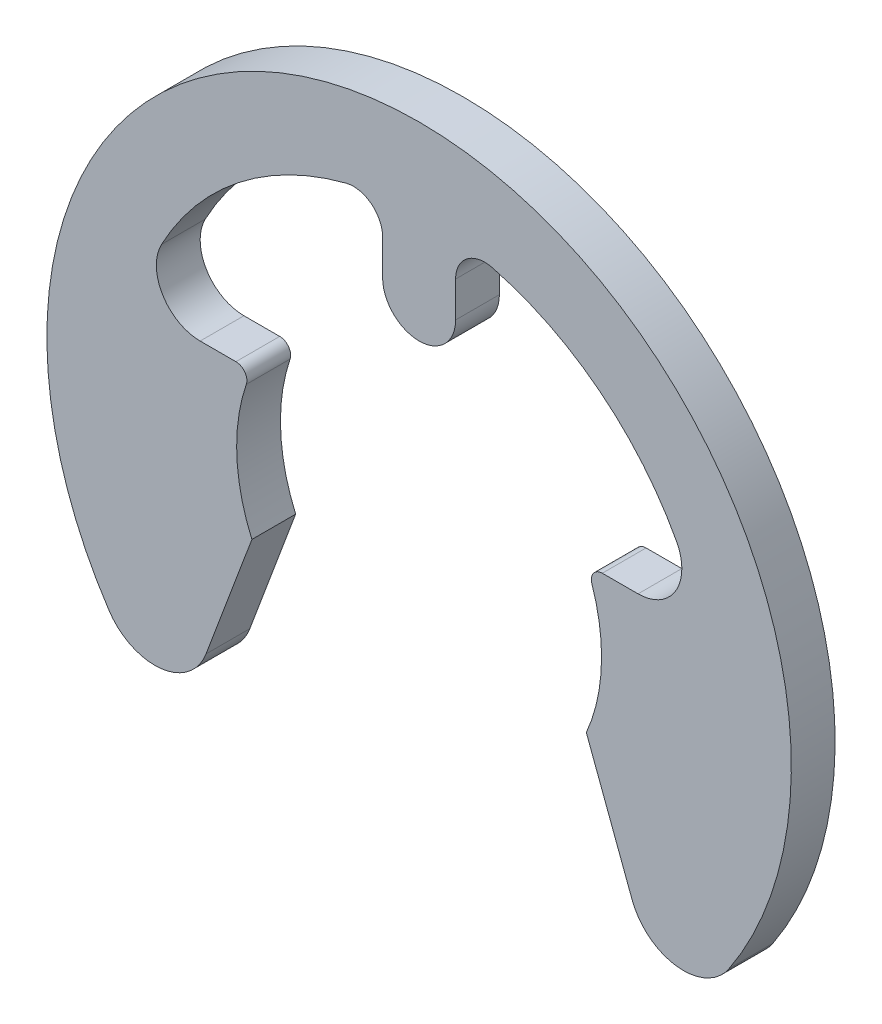
ISO-10303-21;
HEADER;
FILE_DESCRIPTION(('STEP AP214'),'2;1');
FILE_NAME('part.step','',(''),(''),'','','');
FILE_SCHEMA(('AUTOMOTIVE_DESIGN { 1 0 10303 214 1 1 1 1 }'));
ENDSEC;
DATA;
#1=APPLICATION_CONTEXT('core data for automotive mechanical design processes');
#2=APPLICATION_PROTOCOL_DEFINITION('international standard','automotive_design',2000,#1);
#3=PRODUCT_CONTEXT('',#1,'mechanical');
#4=PRODUCT('Part','Part','',(#3));
#5=PRODUCT_RELATED_PRODUCT_CATEGORY('part','',(#4));
#6=PRODUCT_DEFINITION_FORMATION('','',#4);
#7=PRODUCT_DEFINITION_CONTEXT('part definition',#1,'design');
#8=PRODUCT_DEFINITION('design','',#6,#7);
#9=PRODUCT_DEFINITION_SHAPE('','',#8);
#10=(LENGTH_UNIT() NAMED_UNIT(*) SI_UNIT(.MILLI.,.METRE.));
#11=(NAMED_UNIT(*) PLANE_ANGLE_UNIT() SI_UNIT($,.RADIAN.));
#12=(NAMED_UNIT(*) SI_UNIT($,.STERADIAN.) SOLID_ANGLE_UNIT());
#13=UNCERTAINTY_MEASURE_WITH_UNIT(LENGTH_MEASURE(1.E-05),#10,'distance_accuracy_value','');
#14=(GEOMETRIC_REPRESENTATION_CONTEXT(3) GLOBAL_UNCERTAINTY_ASSIGNED_CONTEXT((#13)) GLOBAL_UNIT_ASSIGNED_CONTEXT((#10,
#11,#12)) REPRESENTATION_CONTEXT('',''));
#15=CARTESIAN_POINT('',(0.,0.,0.));
#16=DIRECTION('',(0.,0.,1.));
#17=DIRECTION('',(1.,0.,0.));
#18=AXIS2_PLACEMENT_3D('',#15,#16,#17);
#19=CARTESIAN_POINT('',(0.,-2.8276260652834,1.2));
#20=DIRECTION('',(0.,0.,1.));
#21=DIRECTION('',(1.,0.,0.));
#22=AXIS2_PLACEMENT_3D('',#19,#20,#21);
#23=PLANE('',#22);
#24=DIRECTION('',(0.351633024995585,-0.936137925592407,0.));
#25=VECTOR('',#24,1.);
#26=CARTESIAN_POINT('',(5.83944529930112,-10.8224634769491,1.2));
#27=LINE('',#26,#25);
#28=CARTESIAN_POINT('',(5.83944529930112,-10.8224634769491,1.2));
#29=VERTEX_POINT('',#28);
#30=CARTESIAN_POINT('',(4.58257569495584,-7.476351989933,1.2));
#31=VERTEX_POINT('',#30);
#32=EDGE_CURVE('E177',#29,#31,#27,.F.);
#33=ORIENTED_EDGE('',*,*,#32,.F.);
#34=CARTESIAN_POINT('',(7.24365218768973,-10.2950139394557,1.2));
#35=DIRECTION('',(0.,0.,1.));
#36=DIRECTION('',(1.,0.,0.));
#37=AXIS2_PLACEMENT_3D('',#34,#35,#36);
#38=CIRCLE('',#37,1.5);
#39=CARTESIAN_POINT('',(8.4925577372914,-11.1258177238562,1.2));
#40=VERTEX_POINT('',#39);
#41=EDGE_CURVE('E242',#40,#29,#38,.F.);
#42=ORIENTED_EDGE('',*,*,#41,.F.);
#43=CARTESIAN_POINT('',(0.,-5.476351989933,1.2));
#44=DIRECTION('',(0.,0.,1.));
#45=DIRECTION('',(1.,0.,0.));
#46=AXIS2_PLACEMENT_3D('',#43,#44,#45);
#47=CIRCLE('',#46,10.2);
#48=CARTESIAN_POINT('',(-8.49255773729141,-11.1258177238562,1.2));
#49=VERTEX_POINT('',#48);
#50=EDGE_CURVE('E165',#49,#40,#47,.F.);
#51=ORIENTED_EDGE('',*,*,#50,.F.);
#52=CARTESIAN_POINT('',(-7.24365218768973,-10.2950139394557,1.2));
#53=DIRECTION('',(0.,0.,1.));
#54=DIRECTION('',(1.,0.,0.));
#55=AXIS2_PLACEMENT_3D('',#52,#53,#54);
#56=CIRCLE('',#55,1.5);
#57=CARTESIAN_POINT('',(-5.83944529930112,-10.8224634769491,1.2));
#58=VERTEX_POINT('',#57);
#59=EDGE_CURVE('E20',#58,#49,#56,.F.);
#60=ORIENTED_EDGE('',*,*,#59,.F.);
#61=DIRECTION('',(0.351633024995585,0.936137925592407,0.));
#62=VECTOR('',#61,1.);
#63=CARTESIAN_POINT('',(-4.58257569495584,-7.476351989933,1.2));
#64=LINE('',#63,#62);
#65=CARTESIAN_POINT('',(-4.58257569495584,-7.476351989933,1.2));
#66=VERTEX_POINT('',#65);
#67=EDGE_CURVE('E149',#66,#58,#64,.F.);
#68=ORIENTED_EDGE('',*,*,#67,.F.);
#69=CARTESIAN_POINT('',(0.,-5.476351989933,1.2));
#70=DIRECTION('',(0.,0.,1.));
#71=DIRECTION('',(1.,0.,0.));
#72=AXIS2_PLACEMENT_3D('',#69,#70,#71);
#73=CIRCLE('',#72,5.);
#74=CARTESIAN_POINT('',(-4.7358114709476,-3.87257840502734,1.2));
#75=VERTEX_POINT('',#74);
#76=EDGE_CURVE('E173',#66,#75,#73,.F.);
#77=ORIENTED_EDGE('',*,*,#76,.T.);
#78=CARTESIAN_POINT('',(-5.01996015920445,-3.776351989933,1.2));
#79=DIRECTION('',(0.,0.,1.));
#80=DIRECTION('',(1.,0.,0.));
#81=AXIS2_PLACEMENT_3D('',#78,#79,#80);
#82=CIRCLE('',#81,0.3);
#83=CARTESIAN_POINT('',(-5.01996015920445,-3.476351989933,1.2));
#84=VERTEX_POINT('',#83);
#85=EDGE_CURVE('E270',#84,#75,#82,.F.);
#86=ORIENTED_EDGE('',*,*,#85,.F.);
#87=DIRECTION('',(1.,0.,0.));
#88=VECTOR('',#87,1.);
#89=CARTESIAN_POINT('',(-6.,-3.476351989933,1.2));
#90=LINE('',#89,#88);
#91=CARTESIAN_POINT('',(-6.,-3.476351989933,1.2));
#92=VERTEX_POINT('',#91);
#93=EDGE_CURVE('E193',#92,#84,#90,.T.);
#94=ORIENTED_EDGE('',*,*,#93,.F.);
#95=CARTESIAN_POINT('',(-6.,-2.276351989933,1.2));
#96=DIRECTION('',(0.,0.,1.));
#97=DIRECTION('',(1.,0.,0.));
#98=AXIS2_PLACEMENT_3D('',#95,#96,#97);
#99=CIRCLE('',#98,1.2);
#100=CARTESIAN_POINT('',(-7.05882352941177,-1.71164610758006,1.2));
#101=VERTEX_POINT('',#100);
#102=EDGE_CURVE('E267',#92,#101,#99,.F.);
#103=ORIENTED_EDGE('',*,*,#102,.T.);
#104=CARTESIAN_POINT('',(0.,-5.476351989933,1.2));
#105=DIRECTION('',(0.,0.,1.));
#106=DIRECTION('',(1.,0.,0.));
#107=AXIS2_PLACEMENT_3D('',#104,#105,#106);
#108=CIRCLE('',#107,8.);
#109=CARTESIAN_POINT('',(-2.,2.26961470248183,1.2));
#110=VERTEX_POINT('',#109);
#111=EDGE_CURVE('E264',#101,#110,#108,.F.);
#112=ORIENTED_EDGE('',*,*,#111,.T.);
#113=CARTESIAN_POINT('',(-1.8,1.49501803324035,1.2));
#114=DIRECTION('',(0.,0.,1.));
#115=DIRECTION('',(1.,0.,0.));
#116=AXIS2_PLACEMENT_3D('',#113,#114,#115);
#117=CIRCLE('',#116,0.8);
#118=CARTESIAN_POINT('',(-1.,1.49501803324035,1.2));
#119=VERTEX_POINT('',#118);
#120=EDGE_CURVE('E192',#110,#119,#117,.F.);
#121=ORIENTED_EDGE('',*,*,#120,.T.);
#122=DIRECTION('',(0.,1.,0.));
#123=VECTOR('',#122,1.);
#124=CARTESIAN_POINT('',(-1.,0.523648010066998,1.2));
#125=LINE('',#124,#123);
#126=CARTESIAN_POINT('',(-1.,0.523648010066999,1.2));
#127=VERTEX_POINT('',#126);
#128=EDGE_CURVE('E189',#127,#119,#125,.T.);
#129=ORIENTED_EDGE('',*,*,#128,.F.);
#130=CARTESIAN_POINT('',(0.,0.523648010066999,1.2));
#131=DIRECTION('',(0.,0.,1.));
#132=DIRECTION('',(1.,0.,0.));
#133=AXIS2_PLACEMENT_3D('',#130,#131,#132);
#134=CIRCLE('',#133,1.);
#135=CARTESIAN_POINT('',(1.,0.523648010066998,1.2));
#136=VERTEX_POINT('',#135);
#137=EDGE_CURVE('E259',#136,#127,#134,.F.);
#138=ORIENTED_EDGE('',*,*,#137,.F.);
#139=DIRECTION('',(0.,1.,0.));
#140=VECTOR('',#139,1.);
#141=CARTESIAN_POINT('',(1.,1.49501803324035,1.2));
#142=LINE('',#141,#140);
#143=CARTESIAN_POINT('',(1.,1.49501803324035,1.2));
#144=VERTEX_POINT('',#143);
#145=EDGE_CURVE('E185',#144,#136,#142,.F.);
#146=ORIENTED_EDGE('',*,*,#145,.F.);
#147=CARTESIAN_POINT('',(1.8,1.49501803324035,1.2));
#148=DIRECTION('',(0.,0.,1.));
#149=DIRECTION('',(1.,0.,0.));
#150=AXIS2_PLACEMENT_3D('',#147,#148,#149);
#151=CIRCLE('',#150,0.8);
#152=CARTESIAN_POINT('',(2.,2.26961470248183,1.2));
#153=VERTEX_POINT('',#152);
#154=EDGE_CURVE('E256',#144,#153,#151,.F.);
#155=ORIENTED_EDGE('',*,*,#154,.T.);
#156=CARTESIAN_POINT('',(0.,-5.476351989933,1.2));
#157=DIRECTION('',(0.,0.,1.));
#158=DIRECTION('',(1.,0.,0.));
#159=AXIS2_PLACEMENT_3D('',#156,#157,#158);
#160=CIRCLE('',#159,8.);
#161=CARTESIAN_POINT('',(7.05882352941177,-1.71164610758006,1.2));
#162=VERTEX_POINT('',#161);
#163=EDGE_CURVE('E253',#153,#162,#160,.F.);
#164=ORIENTED_EDGE('',*,*,#163,.T.);
#165=CARTESIAN_POINT('',(6.,-2.276351989933,1.2));
#166=DIRECTION('',(0.,0.,1.));
#167=DIRECTION('',(1.,0.,0.));
#168=AXIS2_PLACEMENT_3D('',#165,#166,#167);
#169=CIRCLE('',#168,1.2);
#170=CARTESIAN_POINT('',(6.,-3.476351989933,1.2));
#171=VERTEX_POINT('',#170);
#172=EDGE_CURVE('E184',#162,#171,#169,.F.);
#173=ORIENTED_EDGE('',*,*,#172,.T.);
#174=DIRECTION('',(1.,0.,0.));
#175=VECTOR('',#174,1.);
#176=CARTESIAN_POINT('',(5.01996015920445,-3.476351989933,1.2));
#177=LINE('',#176,#175);
#178=CARTESIAN_POINT('',(5.01996015920445,-3.476351989933,1.2));
#179=VERTEX_POINT('',#178);
#180=EDGE_CURVE('E181',#179,#171,#177,.T.);
#181=ORIENTED_EDGE('',*,*,#180,.F.);
#182=CARTESIAN_POINT('',(5.01996015920445,-3.776351989933,1.2));
#183=DIRECTION('',(0.,0.,1.));
#184=DIRECTION('',(1.,0.,0.));
#185=AXIS2_PLACEMENT_3D('',#182,#183,#184);
#186=CIRCLE('',#185,0.3);
#187=CARTESIAN_POINT('',(4.7358114709476,-3.87257840502734,1.2));
#188=VERTEX_POINT('',#187);
#189=EDGE_CURVE('E247',#188,#179,#186,.F.);
#190=ORIENTED_EDGE('',*,*,#189,.F.);
#191=CARTESIAN_POINT('',(0.,-5.476351989933,1.2));
#192=DIRECTION('',(0.,0.,1.));
#193=DIRECTION('',(1.,0.,0.));
#194=AXIS2_PLACEMENT_3D('',#191,#192,#193);
#195=CIRCLE('',#194,5.);
#196=EDGE_CURVE('E180',#188,#31,#195,.F.);
#197=ORIENTED_EDGE('',*,*,#196,.T.);
#198=EDGE_LOOP('',(#33,#42,#51,#60,#68,#77,#86,#94,#103,#112,#121,#129,#138,#146,#155,#164,#173,
#181,#190,#197));
#199=FACE_BOUND('',#198,.T.);
#200=ADVANCED_FACE('F17',(#199),#23,.T.);
#201=CARTESIAN_POINT('',(-7.24365218768973,-10.2950139394557,0.));
#202=DIRECTION('',(0.,0.,1.));
#203=DIRECTION('',(1.,0.,0.));
#204=AXIS2_PLACEMENT_3D('',#201,#202,#203);
#205=CYLINDRICAL_SURFACE('',#204,1.5);
#206=CARTESIAN_POINT('',(-7.24365218768973,-10.2950139394557,0.));
#207=DIRECTION('',(0.,0.,1.));
#208=DIRECTION('',(1.,0.,0.));
#209=AXIS2_PLACEMENT_3D('',#206,#207,#208);
#210=CIRCLE('',#209,1.5);
#211=CARTESIAN_POINT('',(-8.49255773729141,-11.1258177238562,0.));
#212=VERTEX_POINT('',#211);
#213=CARTESIAN_POINT('',(-5.83944529930112,-10.8224634769491,0.));
#214=VERTEX_POINT('',#213);
#215=EDGE_CURVE('E171',#212,#214,#210,.T.);
#216=ORIENTED_EDGE('',*,*,#215,.T.);
#217=DIRECTION('',(0.,0.,1.));
#218=VECTOR('',#217,1.);
#219=CARTESIAN_POINT('',(-5.83944529930112,-10.8224634769491,0.));
#220=LINE('',#219,#218);
#221=EDGE_CURVE('E154',#58,#214,#220,.F.);
#222=ORIENTED_EDGE('',*,*,#221,.F.);
#223=ORIENTED_EDGE('',*,*,#59,.T.);
#224=DIRECTION('',(0.,0.,1.));
#225=VECTOR('',#224,1.);
#226=CARTESIAN_POINT('',(-8.49255773729141,-11.1258177238562,0.));
#227=LINE('',#226,#225);
#228=EDGE_CURVE('E239',#212,#49,#227,.T.);
#229=ORIENTED_EDGE('',*,*,#228,.F.);
#230=EDGE_LOOP('',(#216,#222,#223,#229));
#231=FACE_BOUND('',#230,.T.);
#232=ADVANCED_FACE('F170',(#231),#205,.T.);
#233=CARTESIAN_POINT('',(-4.58257569495584,-7.476351989933,0.));
#234=DIRECTION('',(0.936137925592407,-0.351633024995585,0.));
#235=DIRECTION('',(0.351633024995585,0.936137925592407,0.));
#236=AXIS2_PLACEMENT_3D('',#233,#234,#235);
#237=PLANE('',#236);
#238=DIRECTION('',(0.351633024995585,0.936137925592406,0.));
#239=VECTOR('',#238,1.);
#240=CARTESIAN_POINT('',(-5.83944529930112,-10.8224634769491,0.));
#241=LINE('',#240,#239);
#242=CARTESIAN_POINT('',(-4.58257569495584,-7.476351989933,0.));
#243=VERTEX_POINT('',#242);
#244=EDGE_CURVE('E237',#214,#243,#241,.T.);
#245=ORIENTED_EDGE('',*,*,#244,.T.);
#246=DIRECTION('',(0.,0.,1.));
#247=VECTOR('',#246,1.);
#248=CARTESIAN_POINT('',(-4.58257569495584,-7.476351989933,0.));
#249=LINE('',#248,#247);
#250=EDGE_CURVE('E156',#243,#66,#249,.T.);
#251=ORIENTED_EDGE('',*,*,#250,.T.);
#252=ORIENTED_EDGE('',*,*,#67,.T.);
#253=ORIENTED_EDGE('',*,*,#221,.T.);
#254=EDGE_LOOP('',(#245,#251,#252,#253));
#255=FACE_BOUND('',#254,.T.);
#256=ADVANCED_FACE('F152',(#255),#237,.T.);
#257=CARTESIAN_POINT('',(0.,-5.476351989933,0.));
#258=DIRECTION('',(0.,0.,1.));
#259=DIRECTION('',(1.,0.,0.));
#260=AXIS2_PLACEMENT_3D('',#257,#258,#259);
#261=CYLINDRICAL_SURFACE('',#260,5.);
#262=ORIENTED_EDGE('',*,*,#250,.F.);
#263=CARTESIAN_POINT('',(0.,-5.476351989933,0.));
#264=DIRECTION('',(0.,0.,1.));
#265=DIRECTION('',(1.,0.,0.));
#266=AXIS2_PLACEMENT_3D('',#263,#264,#265);
#267=CIRCLE('',#266,5.);
#268=CARTESIAN_POINT('',(-4.7358114709476,-3.87257840502734,0.));
#269=VERTEX_POINT('',#268);
#270=EDGE_CURVE('E234',#243,#269,#267,.F.);
#271=ORIENTED_EDGE('',*,*,#270,.T.);
#272=DIRECTION('',(0.,0.,1.));
#273=VECTOR('',#272,1.);
#274=CARTESIAN_POINT('',(-4.7358114709476,-3.87257840502734,0.));
#275=LINE('',#274,#273);
#276=EDGE_CURVE('E195',#75,#269,#275,.F.);
#277=ORIENTED_EDGE('',*,*,#276,.F.);
#278=ORIENTED_EDGE('',*,*,#76,.F.);
#279=EDGE_LOOP('',(#262,#271,#277,#278));
#280=FACE_BOUND('',#279,.T.);
#281=ADVANCED_FACE('F275',(#280),#261,.F.);
#282=CARTESIAN_POINT('',(-5.01996015920445,-3.776351989933,0.));
#283=DIRECTION('',(0.,0.,1.));
#284=DIRECTION('',(1.,0.,0.));
#285=AXIS2_PLACEMENT_3D('',#282,#283,#284);
#286=CYLINDRICAL_SURFACE('',#285,0.3);
#287=CARTESIAN_POINT('',(-5.01996015920445,-3.776351989933,0.));
#288=DIRECTION('',(0.,0.,1.));
#289=DIRECTION('',(1.,0.,0.));
#290=AXIS2_PLACEMENT_3D('',#287,#288,#289);
#291=CIRCLE('',#290,0.3);
#292=CARTESIAN_POINT('',(-5.01996015920445,-3.476351989933,0.));
#293=VERTEX_POINT('',#292);
#294=EDGE_CURVE('E231',#269,#293,#291,.T.);
#295=ORIENTED_EDGE('',*,*,#294,.T.);
#296=DIRECTION('',(0.,0.,1.));
#297=VECTOR('',#296,1.);
#298=CARTESIAN_POINT('',(-5.01996015920445,-3.476351989933,0.));
#299=LINE('',#298,#297);
#300=EDGE_CURVE('E194',#84,#293,#299,.F.);
#301=ORIENTED_EDGE('',*,*,#300,.F.);
#302=ORIENTED_EDGE('',*,*,#85,.T.);
#303=ORIENTED_EDGE('',*,*,#276,.T.);
#304=EDGE_LOOP('',(#295,#301,#302,#303));
#305=FACE_BOUND('',#304,.T.);
#306=ADVANCED_FACE('F376',(#305),#286,.T.);
#307=CARTESIAN_POINT('',(-6.,-3.476351989933,0.));
#308=DIRECTION('',(0.,1.,0.));
#309=DIRECTION('',(0.,0.,1.));
#310=AXIS2_PLACEMENT_3D('',#307,#308,#309);
#311=PLANE('',#310);
#312=DIRECTION('',(1.,0.,0.));
#313=VECTOR('',#312,1.);
#314=CARTESIAN_POINT('',(0.,-3.476351989933,0.));
#315=LINE('',#314,#313);
#316=CARTESIAN_POINT('',(-6.,-3.476351989933,0.));
#317=VERTEX_POINT('',#316);
#318=EDGE_CURVE('E230',#293,#317,#315,.F.);
#319=ORIENTED_EDGE('',*,*,#318,.T.);
#320=DIRECTION('',(0.,0.,1.));
#321=VECTOR('',#320,1.);
#322=CARTESIAN_POINT('',(-6.,-3.476351989933,0.));
#323=LINE('',#322,#321);
#324=EDGE_CURVE('E269',#317,#92,#323,.T.);
#325=ORIENTED_EDGE('',*,*,#324,.T.);
#326=ORIENTED_EDGE('',*,*,#93,.T.);
#327=ORIENTED_EDGE('',*,*,#300,.T.);
#328=EDGE_LOOP('',(#319,#325,#326,#327));
#329=FACE_BOUND('',#328,.T.);
#330=ADVANCED_FACE('F375',(#329),#311,.T.);
#331=CARTESIAN_POINT('',(-6.,-2.276351989933,0.));
#332=DIRECTION('',(0.,0.,1.));
#333=DIRECTION('',(1.,0.,0.));
#334=AXIS2_PLACEMENT_3D('',#331,#332,#333);
#335=CYLINDRICAL_SURFACE('',#334,1.2);
#336=ORIENTED_EDGE('',*,*,#324,.F.);
#337=CARTESIAN_POINT('',(-6.,-2.276351989933,0.));
#338=DIRECTION('',(0.,0.,1.));
#339=DIRECTION('',(1.,0.,0.));
#340=AXIS2_PLACEMENT_3D('',#337,#338,#339);
#341=CIRCLE('',#340,1.2);
#342=CARTESIAN_POINT('',(-7.05882352941177,-1.71164610758006,0.));
#343=VERTEX_POINT('',#342);
#344=EDGE_CURVE('E227',#317,#343,#341,.F.);
#345=ORIENTED_EDGE('',*,*,#344,.T.);
#346=DIRECTION('',(0.,0.,1.));
#347=VECTOR('',#346,1.);
#348=CARTESIAN_POINT('',(-7.05882352941177,-1.71164610758006,0.));
#349=LINE('',#348,#347);
#350=EDGE_CURVE('E266',#343,#101,#349,.T.);
#351=ORIENTED_EDGE('',*,*,#350,.T.);
#352=ORIENTED_EDGE('',*,*,#102,.F.);
#353=EDGE_LOOP('',(#336,#345,#351,#352));
#354=FACE_BOUND('',#353,.T.);
#355=ADVANCED_FACE('F372',(#354),#335,.F.);
#356=CARTESIAN_POINT('',(0.,-5.476351989933,0.));
#357=DIRECTION('',(0.,0.,1.));
#358=DIRECTION('',(1.,0.,0.));
#359=AXIS2_PLACEMENT_3D('',#356,#357,#358);
#360=CYLINDRICAL_SURFACE('',#359,8.);
#361=ORIENTED_EDGE('',*,*,#350,.F.);
#362=CARTESIAN_POINT('',(0.,-5.476351989933,0.));
#363=DIRECTION('',(0.,0.,1.));
#364=DIRECTION('',(1.,0.,0.));
#365=AXIS2_PLACEMENT_3D('',#362,#363,#364);
#366=CIRCLE('',#365,8.);
#367=CARTESIAN_POINT('',(-2.,2.26961470248183,0.));
#368=VERTEX_POINT('',#367);
#369=EDGE_CURVE('E224',#343,#368,#366,.F.);
#370=ORIENTED_EDGE('',*,*,#369,.T.);
#371=DIRECTION('',(0.,0.,1.));
#372=VECTOR('',#371,1.);
#373=CARTESIAN_POINT('',(-2.,2.26961470248183,0.));
#374=LINE('',#373,#372);
#375=EDGE_CURVE('E263',#368,#110,#374,.T.);
#376=ORIENTED_EDGE('',*,*,#375,.T.);
#377=ORIENTED_EDGE('',*,*,#111,.F.);
#378=EDGE_LOOP('',(#361,#370,#376,#377));
#379=FACE_BOUND('',#378,.T.);
#380=ADVANCED_FACE('F368',(#379),#360,.F.);
#381=CARTESIAN_POINT('',(-1.8,1.49501803324035,0.));
#382=DIRECTION('',(0.,0.,1.));
#383=DIRECTION('',(1.,0.,0.));
#384=AXIS2_PLACEMENT_3D('',#381,#382,#383);
#385=CYLINDRICAL_SURFACE('',#384,0.8);
#386=ORIENTED_EDGE('',*,*,#375,.F.);
#387=CARTESIAN_POINT('',(-1.8,1.49501803324035,0.));
#388=DIRECTION('',(0.,0.,1.));
#389=DIRECTION('',(1.,0.,0.));
#390=AXIS2_PLACEMENT_3D('',#387,#388,#389);
#391=CIRCLE('',#390,0.8);
#392=CARTESIAN_POINT('',(-1.,1.49501803324035,0.));
#393=VERTEX_POINT('',#392);
#394=EDGE_CURVE('E221',#368,#393,#391,.F.);
#395=ORIENTED_EDGE('',*,*,#394,.T.);
#396=DIRECTION('',(0.,0.,1.));
#397=VECTOR('',#396,1.);
#398=CARTESIAN_POINT('',(-1.,1.49501803324035,0.));
#399=LINE('',#398,#397);
#400=EDGE_CURVE('E191',#119,#393,#399,.F.);
#401=ORIENTED_EDGE('',*,*,#400,.F.);
#402=ORIENTED_EDGE('',*,*,#120,.F.);
#403=EDGE_LOOP('',(#386,#395,#401,#402));
#404=FACE_BOUND('',#403,.T.);
#405=ADVANCED_FACE('F364',(#404),#385,.F.);
#406=CARTESIAN_POINT('',(-1.,0.523648010066998,0.));
#407=DIRECTION('',(-1.,0.,0.));
#408=DIRECTION('',(0.,0.,1.));
#409=AXIS2_PLACEMENT_3D('',#406,#407,#408);
#410=PLANE('',#409);
#411=DIRECTION('',(0.,1.,0.));
#412=VECTOR('',#411,1.);
#413=CARTESIAN_POINT('',(-1.,-2.8276260652834,0.));
#414=LINE('',#413,#412);
#415=CARTESIAN_POINT('',(-1.,0.523648010066999,0.));
#416=VERTEX_POINT('',#415);
#417=EDGE_CURVE('E220',#393,#416,#414,.F.);
#418=ORIENTED_EDGE('',*,*,#417,.T.);
#419=DIRECTION('',(0.,0.,1.));
#420=VECTOR('',#419,1.);
#421=CARTESIAN_POINT('',(-1.,0.523648010066998,0.));
#422=LINE('',#421,#420);
#423=EDGE_CURVE('E188',#127,#416,#422,.F.);
#424=ORIENTED_EDGE('',*,*,#423,.F.);
#425=ORIENTED_EDGE('',*,*,#128,.T.);
#426=ORIENTED_EDGE('',*,*,#400,.T.);
#427=EDGE_LOOP('',(#418,#424,#425,#426));
#428=FACE_BOUND('',#427,.T.);
#429=ADVANCED_FACE('F360',(#428),#410,.T.);
#430=CARTESIAN_POINT('',(0.,0.523648010066999,0.));
#431=DIRECTION('',(0.,0.,1.));
#432=DIRECTION('',(1.,0.,0.));
#433=AXIS2_PLACEMENT_3D('',#430,#431,#432);
#434=CYLINDRICAL_SURFACE('',#433,1.);
#435=CARTESIAN_POINT('',(0.,0.523648010066999,0.));
#436=DIRECTION('',(0.,0.,1.));
#437=DIRECTION('',(1.,0.,0.));
#438=AXIS2_PLACEMENT_3D('',#435,#436,#437);
#439=CIRCLE('',#438,1.);
#440=CARTESIAN_POINT('',(1.,0.523648010066998,0.));
#441=VERTEX_POINT('',#440);
#442=EDGE_CURVE('E217',#416,#441,#439,.T.);
#443=ORIENTED_EDGE('',*,*,#442,.T.);
#444=DIRECTION('',(0.,0.,-1.));
#445=VECTOR('',#444,1.);
#446=CARTESIAN_POINT('',(1.,0.523648010066998,0.));
#447=LINE('',#446,#445);
#448=EDGE_CURVE('E187',#136,#441,#447,.T.);
#449=ORIENTED_EDGE('',*,*,#448,.F.);
#450=ORIENTED_EDGE('',*,*,#137,.T.);
#451=ORIENTED_EDGE('',*,*,#423,.T.);
#452=EDGE_LOOP('',(#443,#449,#450,#451));
#453=FACE_BOUND('',#452,.T.);
#454=ADVANCED_FACE('F354',(#453),#434,.T.);
#455=CARTESIAN_POINT('',(1.,1.49501803324035,0.));
#456=DIRECTION('',(1.,0.,0.));
#457=DIRECTION('',(0.,0.,-1.));
#458=AXIS2_PLACEMENT_3D('',#455,#456,#457);
#459=PLANE('',#458);
#460=DIRECTION('',(0.,1.,0.));
#461=VECTOR('',#460,1.);
#462=CARTESIAN_POINT('',(1.,-2.8276260652834,0.));
#463=LINE('',#462,#461);
#464=CARTESIAN_POINT('',(1.,1.49501803324035,0.));
#465=VERTEX_POINT('',#464);
#466=EDGE_CURVE('E216',#441,#465,#463,.T.);
#467=ORIENTED_EDGE('',*,*,#466,.T.);
#468=DIRECTION('',(0.,0.,1.));
#469=VECTOR('',#468,1.);
#470=CARTESIAN_POINT('',(1.,1.49501803324035,0.));
#471=LINE('',#470,#469);
#472=EDGE_CURVE('E258',#465,#144,#471,.T.);
#473=ORIENTED_EDGE('',*,*,#472,.T.);
#474=ORIENTED_EDGE('',*,*,#145,.T.);
#475=ORIENTED_EDGE('',*,*,#448,.T.);
#476=EDGE_LOOP('',(#467,#473,#474,#475));
#477=FACE_BOUND('',#476,.T.);
#478=ADVANCED_FACE('F350',(#477),#459,.T.);
#479=CARTESIAN_POINT('',(1.8,1.49501803324035,0.));
#480=DIRECTION('',(0.,0.,1.));
#481=DIRECTION('',(1.,0.,0.));
#482=AXIS2_PLACEMENT_3D('',#479,#480,#481);
#483=CYLINDRICAL_SURFACE('',#482,0.8);
#484=ORIENTED_EDGE('',*,*,#472,.F.);
#485=CARTESIAN_POINT('',(1.8,1.49501803324035,0.));
#486=DIRECTION('',(0.,0.,1.));
#487=DIRECTION('',(1.,0.,0.));
#488=AXIS2_PLACEMENT_3D('',#485,#486,#487);
#489=CIRCLE('',#488,0.8);
#490=CARTESIAN_POINT('',(2.,2.26961470248183,0.));
#491=VERTEX_POINT('',#490);
#492=EDGE_CURVE('E213',#465,#491,#489,.F.);
#493=ORIENTED_EDGE('',*,*,#492,.T.);
#494=DIRECTION('',(0.,0.,1.));
#495=VECTOR('',#494,1.);
#496=CARTESIAN_POINT('',(2.,2.26961470248183,0.));
#497=LINE('',#496,#495);
#498=EDGE_CURVE('E255',#491,#153,#497,.T.);
#499=ORIENTED_EDGE('',*,*,#498,.T.);
#500=ORIENTED_EDGE('',*,*,#154,.F.);
#501=EDGE_LOOP('',(#484,#493,#499,#500));
#502=FACE_BOUND('',#501,.T.);
#503=ADVANCED_FACE('F346',(#502),#483,.F.);
#504=CARTESIAN_POINT('',(0.,-5.476351989933,0.));
#505=DIRECTION('',(0.,0.,1.));
#506=DIRECTION('',(1.,0.,0.));
#507=AXIS2_PLACEMENT_3D('',#504,#505,#506);
#508=CYLINDRICAL_SURFACE('',#507,8.);
#509=ORIENTED_EDGE('',*,*,#498,.F.);
#510=CARTESIAN_POINT('',(0.,-5.476351989933,0.));
#511=DIRECTION('',(0.,0.,1.));
#512=DIRECTION('',(1.,0.,0.));
#513=AXIS2_PLACEMENT_3D('',#510,#511,#512);
#514=CIRCLE('',#513,8.);
#515=CARTESIAN_POINT('',(7.05882352941177,-1.71164610758006,0.));
#516=VERTEX_POINT('',#515);
#517=EDGE_CURVE('E210',#491,#516,#514,.F.);
#518=ORIENTED_EDGE('',*,*,#517,.T.);
#519=DIRECTION('',(0.,0.,1.));
#520=VECTOR('',#519,1.);
#521=CARTESIAN_POINT('',(7.05882352941177,-1.71164610758006,0.));
#522=LINE('',#521,#520);
#523=EDGE_CURVE('E252',#516,#162,#522,.T.);
#524=ORIENTED_EDGE('',*,*,#523,.T.);
#525=ORIENTED_EDGE('',*,*,#163,.F.);
#526=EDGE_LOOP('',(#509,#518,#524,#525));
#527=FACE_BOUND('',#526,.T.);
#528=ADVANCED_FACE('F342',(#527),#508,.F.);
#529=CARTESIAN_POINT('',(6.,-2.276351989933,0.));
#530=DIRECTION('',(0.,0.,1.));
#531=DIRECTION('',(1.,0.,0.));
#532=AXIS2_PLACEMENT_3D('',#529,#530,#531);
#533=CYLINDRICAL_SURFACE('',#532,1.2);
#534=ORIENTED_EDGE('',*,*,#523,.F.);
#535=CARTESIAN_POINT('',(6.,-2.276351989933,0.));
#536=DIRECTION('',(0.,0.,1.));
#537=DIRECTION('',(1.,0.,0.));
#538=AXIS2_PLACEMENT_3D('',#535,#536,#537);
#539=CIRCLE('',#538,1.2);
#540=CARTESIAN_POINT('',(6.,-3.476351989933,0.));
#541=VERTEX_POINT('',#540);
#542=EDGE_CURVE('E207',#516,#541,#539,.F.);
#543=ORIENTED_EDGE('',*,*,#542,.T.);
#544=DIRECTION('',(0.,0.,1.));
#545=VECTOR('',#544,1.);
#546=CARTESIAN_POINT('',(6.,-3.476351989933,0.));
#547=LINE('',#546,#545);
#548=EDGE_CURVE('E183',#171,#541,#547,.F.);
#549=ORIENTED_EDGE('',*,*,#548,.F.);
#550=ORIENTED_EDGE('',*,*,#172,.F.);
#551=EDGE_LOOP('',(#534,#543,#549,#550));
#552=FACE_BOUND('',#551,.T.);
#553=ADVANCED_FACE('F338',(#552),#533,.F.);
#554=CARTESIAN_POINT('',(5.01996015920445,-3.476351989933,0.));
#555=DIRECTION('',(0.,1.,0.));
#556=DIRECTION('',(0.,0.,1.));
#557=AXIS2_PLACEMENT_3D('',#554,#555,#556);
#558=PLANE('',#557);
#559=DIRECTION('',(1.,0.,0.));
#560=VECTOR('',#559,1.);
#561=CARTESIAN_POINT('',(0.,-3.476351989933,0.));
#562=LINE('',#561,#560);
#563=CARTESIAN_POINT('',(5.01996015920445,-3.476351989933,0.));
#564=VERTEX_POINT('',#563);
#565=EDGE_CURVE('E206',#541,#564,#562,.F.);
#566=ORIENTED_EDGE('',*,*,#565,.T.);
#567=DIRECTION('',(0.,0.,1.));
#568=VECTOR('',#567,1.);
#569=CARTESIAN_POINT('',(5.01996015920445,-3.476351989933,0.));
#570=LINE('',#569,#568);
#571=EDGE_CURVE('E249',#179,#564,#570,.F.);
#572=ORIENTED_EDGE('',*,*,#571,.F.);
#573=ORIENTED_EDGE('',*,*,#180,.T.);
#574=ORIENTED_EDGE('',*,*,#548,.T.);
#575=EDGE_LOOP('',(#566,#572,#573,#574));
#576=FACE_BOUND('',#575,.T.);
#577=ADVANCED_FACE('F334',(#576),#558,.T.);
#578=CARTESIAN_POINT('',(5.01996015920445,-3.776351989933,0.));
#579=DIRECTION('',(0.,0.,1.));
#580=DIRECTION('',(1.,0.,0.));
#581=AXIS2_PLACEMENT_3D('',#578,#579,#580);
#582=CYLINDRICAL_SURFACE('',#581,0.3);
#583=CARTESIAN_POINT('',(5.01996015920445,-3.776351989933,0.));
#584=DIRECTION('',(0.,0.,1.));
#585=DIRECTION('',(1.,0.,0.));
#586=AXIS2_PLACEMENT_3D('',#583,#584,#585);
#587=CIRCLE('',#586,0.3);
#588=CARTESIAN_POINT('',(4.7358114709476,-3.87257840502734,0.));
#589=VERTEX_POINT('',#588);
#590=EDGE_CURVE('E203',#564,#589,#587,.T.);
#591=ORIENTED_EDGE('',*,*,#590,.T.);
#592=DIRECTION('',(0.,0.,1.));
#593=VECTOR('',#592,1.);
#594=CARTESIAN_POINT('',(4.7358114709476,-3.87257840502734,0.));
#595=LINE('',#594,#593);
#596=EDGE_CURVE('E246',#589,#188,#595,.T.);
#597=ORIENTED_EDGE('',*,*,#596,.T.);
#598=ORIENTED_EDGE('',*,*,#189,.T.);
#599=ORIENTED_EDGE('',*,*,#571,.T.);
#600=EDGE_LOOP('',(#591,#597,#598,#599));
#601=FACE_BOUND('',#600,.T.);
#602=ADVANCED_FACE('F328',(#601),#582,.T.);
#603=CARTESIAN_POINT('',(0.,-5.476351989933,0.));
#604=DIRECTION('',(0.,0.,1.));
#605=DIRECTION('',(1.,0.,0.));
#606=AXIS2_PLACEMENT_3D('',#603,#604,#605);
#607=CYLINDRICAL_SURFACE('',#606,5.);
#608=ORIENTED_EDGE('',*,*,#596,.F.);
#609=CARTESIAN_POINT('',(0.,-5.476351989933,0.));
#610=DIRECTION('',(0.,0.,1.));
#611=DIRECTION('',(1.,0.,0.));
#612=AXIS2_PLACEMENT_3D('',#609,#610,#611);
#613=CIRCLE('',#612,5.);
#614=CARTESIAN_POINT('',(4.58257569495584,-7.476351989933,0.));
#615=VERTEX_POINT('',#614);
#616=EDGE_CURVE('E200',#589,#615,#613,.F.);
#617=ORIENTED_EDGE('',*,*,#616,.T.);
#618=DIRECTION('',(0.,0.,1.));
#619=VECTOR('',#618,1.);
#620=CARTESIAN_POINT('',(4.58257569495584,-7.476351989933,0.));
#621=LINE('',#620,#619);
#622=EDGE_CURVE('E179',#31,#615,#621,.F.);
#623=ORIENTED_EDGE('',*,*,#622,.F.);
#624=ORIENTED_EDGE('',*,*,#196,.F.);
#625=EDGE_LOOP('',(#608,#617,#623,#624));
#626=FACE_BOUND('',#625,.T.);
#627=ADVANCED_FACE('F325',(#626),#607,.F.);
#628=CARTESIAN_POINT('',(5.83944529930112,-10.8224634769491,0.));
#629=DIRECTION('',(-0.936137925592407,-0.351633024995585,0.));
#630=DIRECTION('',(0.351633024995585,-0.936137925592407,0.));
#631=AXIS2_PLACEMENT_3D('',#628,#629,#630);
#632=PLANE('',#631);
#633=DIRECTION('',(0.351633024995585,-0.936137925592406,0.));
#634=VECTOR('',#633,1.);
#635=CARTESIAN_POINT('',(4.58257569495584,-7.476351989933,0.));
#636=LINE('',#635,#634);
#637=CARTESIAN_POINT('',(5.83944529930112,-10.8224634769491,0.));
#638=VERTEX_POINT('',#637);
#639=EDGE_CURVE('E199',#615,#638,#636,.T.);
#640=ORIENTED_EDGE('',*,*,#639,.T.);
#641=DIRECTION('',(0.,0.,1.));
#642=VECTOR('',#641,1.);
#643=CARTESIAN_POINT('',(5.83944529930112,-10.8224634769491,0.));
#644=LINE('',#643,#642);
#645=EDGE_CURVE('E241',#29,#638,#644,.F.);
#646=ORIENTED_EDGE('',*,*,#645,.F.);
#647=ORIENTED_EDGE('',*,*,#32,.T.);
#648=ORIENTED_EDGE('',*,*,#622,.T.);
#649=EDGE_LOOP('',(#640,#646,#647,#648));
#650=FACE_BOUND('',#649,.T.);
#651=ADVANCED_FACE('F317',(#650),#632,.T.);
#652=CARTESIAN_POINT('',(7.24365218768973,-10.2950139394557,0.));
#653=DIRECTION('',(0.,0.,1.));
#654=DIRECTION('',(1.,0.,0.));
#655=AXIS2_PLACEMENT_3D('',#652,#653,#654);
#656=CYLINDRICAL_SURFACE('',#655,1.5);
#657=CARTESIAN_POINT('',(7.24365218768973,-10.2950139394557,0.));
#658=DIRECTION('',(0.,0.,1.));
#659=DIRECTION('',(1.,0.,0.));
#660=AXIS2_PLACEMENT_3D('',#657,#658,#659);
#661=CIRCLE('',#660,1.5);
#662=CARTESIAN_POINT('',(8.4925577372914,-11.1258177238562,0.));
#663=VERTEX_POINT('',#662);
#664=EDGE_CURVE('E26',#638,#663,#661,.T.);
#665=ORIENTED_EDGE('',*,*,#664,.T.);
#666=DIRECTION('',(0.,0.,1.));
#667=VECTOR('',#666,1.);
#668=CARTESIAN_POINT('',(8.4925577372914,-11.1258177238562,0.));
#669=LINE('',#668,#667);
#670=EDGE_CURVE('E34',#40,#663,#669,.F.);
#671=ORIENTED_EDGE('',*,*,#670,.F.);
#672=ORIENTED_EDGE('',*,*,#41,.T.);
#673=ORIENTED_EDGE('',*,*,#645,.T.);
#674=EDGE_LOOP('',(#665,#671,#672,#673));
#675=FACE_BOUND('',#674,.T.);
#676=ADVANCED_FACE('F379',(#675),#656,.T.);
#677=CARTESIAN_POINT('',(0.,-5.476351989933,0.));
#678=DIRECTION('',(0.,0.,1.));
#679=DIRECTION('',(1.,0.,0.));
#680=AXIS2_PLACEMENT_3D('',#677,#678,#679);
#681=CYLINDRICAL_SURFACE('',#680,10.2);
#682=CARTESIAN_POINT('',(0.,-5.476351989933,0.));
#683=DIRECTION('',(0.,0.,1.));
#684=DIRECTION('',(1.,0.,0.));
#685=AXIS2_PLACEMENT_3D('',#682,#683,#684);
#686=CIRCLE('',#685,10.2);
#687=EDGE_CURVE('E11',#663,#212,#686,.T.);
#688=ORIENTED_EDGE('',*,*,#687,.T.);
#689=ORIENTED_EDGE('',*,*,#228,.T.);
#690=ORIENTED_EDGE('',*,*,#50,.T.);
#691=ORIENTED_EDGE('',*,*,#670,.T.);
#692=EDGE_LOOP('',(#688,#689,#690,#691));
#693=FACE_BOUND('',#692,.T.);
#694=ADVANCED_FACE('F377',(#693),#681,.T.);
#695=CARTESIAN_POINT('',(0.,-2.8276260652834,0.));
#696=DIRECTION('',(0.,0.,1.));
#697=DIRECTION('',(1.,0.,0.));
#698=AXIS2_PLACEMENT_3D('',#695,#696,#697);
#699=PLANE('',#698);
#700=ORIENTED_EDGE('',*,*,#664,.F.);
#701=ORIENTED_EDGE('',*,*,#639,.F.);
#702=ORIENTED_EDGE('',*,*,#616,.F.);
#703=ORIENTED_EDGE('',*,*,#590,.F.);
#704=ORIENTED_EDGE('',*,*,#565,.F.);
#705=ORIENTED_EDGE('',*,*,#542,.F.);
#706=ORIENTED_EDGE('',*,*,#517,.F.);
#707=ORIENTED_EDGE('',*,*,#492,.F.);
#708=ORIENTED_EDGE('',*,*,#466,.F.);
#709=ORIENTED_EDGE('',*,*,#442,.F.);
#710=ORIENTED_EDGE('',*,*,#417,.F.);
#711=ORIENTED_EDGE('',*,*,#394,.F.);
#712=ORIENTED_EDGE('',*,*,#369,.F.);
#713=ORIENTED_EDGE('',*,*,#344,.F.);
#714=ORIENTED_EDGE('',*,*,#318,.F.);
#715=ORIENTED_EDGE('',*,*,#294,.F.);
#716=ORIENTED_EDGE('',*,*,#270,.F.);
#717=ORIENTED_EDGE('',*,*,#244,.F.);
#718=ORIENTED_EDGE('',*,*,#215,.F.);
#719=ORIENTED_EDGE('',*,*,#687,.F.);
#720=EDGE_LOOP('',(#700,#701,#702,#703,#704,#705,#706,#707,#708,#709,#710,#711,#712,#713,#714,
#715,#716,#717,#718,#719));
#721=FACE_BOUND('',#720,.T.);
#722=ADVANCED_FACE('F322',(#721),#699,.F.);
#723=CLOSED_SHELL('',(#200,#232,#256,#281,#306,#330,#355,#380,#405,#429,#454,#478,#503,#528,
#553,#577,#602,#627,#651,#676,#694,#722));
#724=MANIFOLD_SOLID_BREP('B1',#723);
#725=ADVANCED_BREP_SHAPE_REPRESENTATION('',(#18,#724),#14);
#726=SHAPE_DEFINITION_REPRESENTATION(#9,#725);
ENDSEC;
END-ISO-10303-21;
